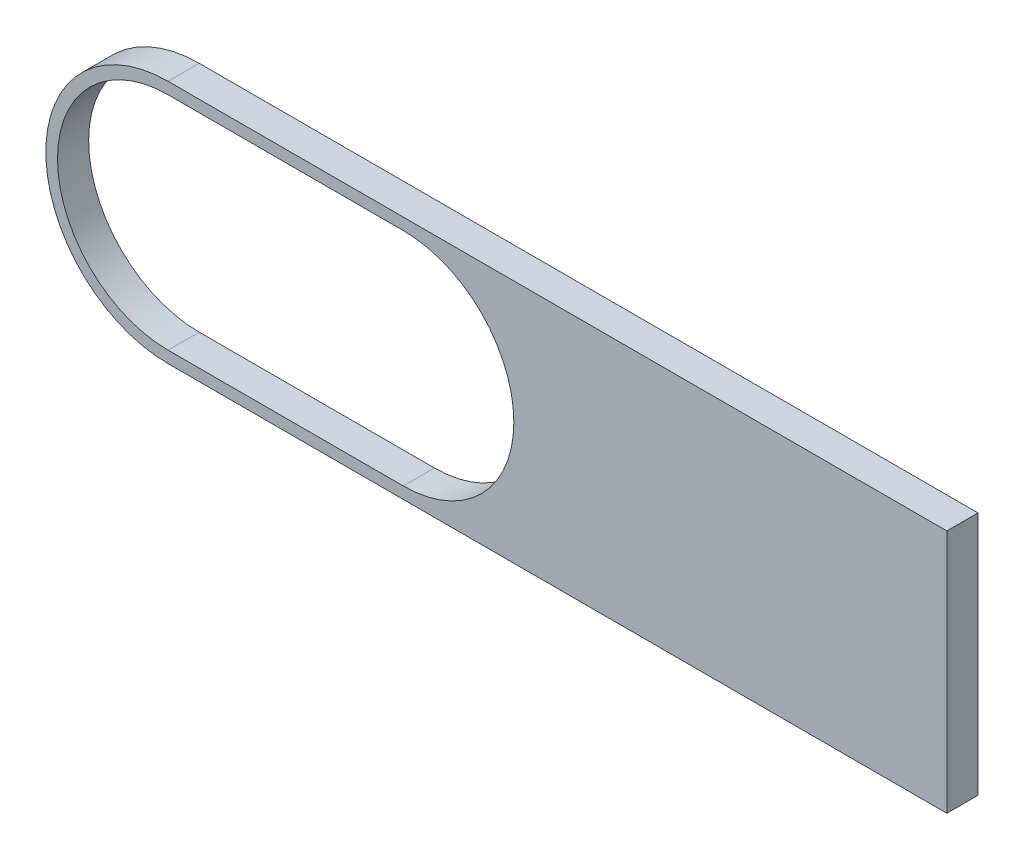
ISO-10303-21;
HEADER;
FILE_DESCRIPTION(('STEP AP214'),'2;1');
FILE_NAME('part.step','',(''),(''),'','','');
FILE_SCHEMA(('AUTOMOTIVE_DESIGN { 1 0 10303 214 1 1 1 1 }'));
ENDSEC;
DATA;
#1=APPLICATION_CONTEXT('core data for automotive mechanical design processes');
#2=APPLICATION_PROTOCOL_DEFINITION('international standard','automotive_design',2000,#1);
#3=PRODUCT_CONTEXT('',#1,'mechanical');
#4=PRODUCT('Part','Part','',(#3));
#5=PRODUCT_RELATED_PRODUCT_CATEGORY('part','',(#4));
#6=PRODUCT_DEFINITION_FORMATION('','',#4);
#7=PRODUCT_DEFINITION_CONTEXT('part definition',#1,'design');
#8=PRODUCT_DEFINITION('design','',#6,#7);
#9=PRODUCT_DEFINITION_SHAPE('','',#8);
#10=(LENGTH_UNIT() NAMED_UNIT(*) SI_UNIT(.MILLI.,.METRE.));
#11=(NAMED_UNIT(*) PLANE_ANGLE_UNIT() SI_UNIT($,.RADIAN.));
#12=(NAMED_UNIT(*) SI_UNIT($,.STERADIAN.) SOLID_ANGLE_UNIT());
#13=UNCERTAINTY_MEASURE_WITH_UNIT(LENGTH_MEASURE(1.E-05),#10,'distance_accuracy_value','');
#14=(GEOMETRIC_REPRESENTATION_CONTEXT(3) GLOBAL_UNCERTAINTY_ASSIGNED_CONTEXT((#13)) GLOBAL_UNIT_ASSIGNED_CONTEXT((#10,
#11,#12)) REPRESENTATION_CONTEXT('',''));
#15=CARTESIAN_POINT('',(0.,0.,0.));
#16=DIRECTION('',(0.,0.,1.));
#17=DIRECTION('',(1.,0.,0.));
#18=AXIS2_PLACEMENT_3D('',#15,#16,#17);
#19=CARTESIAN_POINT('',(0.,18.034,0.));
#20=DIRECTION('',(0.,1.,0.));
#21=DIRECTION('',(0.,0.,1.));
#22=AXIS2_PLACEMENT_3D('',#19,#20,#21);
#23=PLANE('',#22);
#24=DIRECTION('',(0.,0.,1.));
#25=VECTOR('',#24,1.);
#26=CARTESIAN_POINT('',(38.354,18.034,0.));
#27=LINE('',#26,#25);
#28=CARTESIAN_POINT('',(38.354,18.034,0.));
#29=VERTEX_POINT('',#28);
#30=CARTESIAN_POINT('',(38.354,18.034,5.08));
#31=VERTEX_POINT('',#30);
#32=EDGE_CURVE('E52',#29,#31,#27,.T.);
#33=ORIENTED_EDGE('',*,*,#32,.T.);
#34=DIRECTION('',(-1.,0.,0.));
#35=VECTOR('',#34,1.);
#36=CARTESIAN_POINT('',(0.,18.034,5.08));
#37=LINE('',#36,#35);
#38=CARTESIAN_POINT('',(0.,18.034,5.08));
#39=VERTEX_POINT('',#38);
#40=EDGE_CURVE('E108',#31,#39,#37,.T.);
#41=ORIENTED_EDGE('',*,*,#40,.T.);
#42=DIRECTION('',(0.,0.,1.));
#43=VECTOR('',#42,1.);
#44=CARTESIAN_POINT('',(0.,18.034,0.));
#45=LINE('',#44,#43);
#46=CARTESIAN_POINT('',(0.,18.034,0.));
#47=VERTEX_POINT('',#46);
#48=EDGE_CURVE('E107',#47,#39,#45,.T.);
#49=ORIENTED_EDGE('',*,*,#48,.F.);
#50=DIRECTION('',(-1.,0.,0.));
#51=VECTOR('',#50,1.);
#52=CARTESIAN_POINT('',(0.,18.034,0.));
#53=LINE('',#52,#51);
#54=EDGE_CURVE('E48',#29,#47,#53,.T.);
#55=ORIENTED_EDGE('',*,*,#54,.F.);
#56=EDGE_LOOP('',(#33,#41,#49,#55));
#57=FACE_BOUND('',#56,.T.);
#58=ADVANCED_FACE('F33',(#57),#23,.F.);
#59=CARTESIAN_POINT('',(0.,0.,5.08));
#60=DIRECTION('',(0.,0.,-1.));
#61=DIRECTION('',(-1.,0.,0.));
#62=AXIS2_PLACEMENT_3D('',#59,#60,#61);
#63=CYLINDRICAL_SURFACE('',#62,19.939);
#64=DIRECTION('',(0.,0.,-1.));
#65=VECTOR('',#64,1.);
#66=CARTESIAN_POINT('',(0.,-19.939,5.07999999999999));
#67=LINE('',#66,#65);
#68=CARTESIAN_POINT('',(0.,-19.939,5.08));
#69=VERTEX_POINT('',#68);
#70=CARTESIAN_POINT('',(0.,-19.939,0.));
#71=VERTEX_POINT('',#70);
#72=EDGE_CURVE('E116',#69,#71,#67,.T.);
#73=ORIENTED_EDGE('',*,*,#72,.F.);
#74=CARTESIAN_POINT('',(0.,0.,5.08));
#75=DIRECTION('',(0.,0.,1.));
#76=DIRECTION('',(1.,0.,0.));
#77=AXIS2_PLACEMENT_3D('',#74,#75,#76);
#78=CIRCLE('',#77,19.939);
#79=CARTESIAN_POINT('',(0.,19.939,5.08));
#80=VERTEX_POINT('',#79);
#81=EDGE_CURVE('E11',#80,#69,#78,.T.);
#82=ORIENTED_EDGE('',*,*,#81,.F.);
#83=DIRECTION('',(0.,0.,1.));
#84=VECTOR('',#83,1.);
#85=CARTESIAN_POINT('',(0.,19.939,5.08));
#86=LINE('',#85,#84);
#87=CARTESIAN_POINT('',(0.,19.939,0.));
#88=VERTEX_POINT('',#87);
#89=EDGE_CURVE('E120',#88,#80,#86,.T.);
#90=ORIENTED_EDGE('',*,*,#89,.F.);
#91=CARTESIAN_POINT('',(0.,0.,0.));
#92=DIRECTION('',(0.,0.,1.));
#93=DIRECTION('',(1.,0.,0.));
#94=AXIS2_PLACEMENT_3D('',#91,#92,#93);
#95=CIRCLE('',#94,19.939);
#96=EDGE_CURVE('E37',#88,#71,#95,.T.);
#97=ORIENTED_EDGE('',*,*,#96,.T.);
#98=EDGE_LOOP('',(#73,#82,#90,#97));
#99=FACE_BOUND('',#98,.T.);
#100=ADVANCED_FACE('F35',(#99),#63,.T.);
#101=CARTESIAN_POINT('',(0.,0.,5.08));
#102=DIRECTION('',(0.,0.,1.));
#103=DIRECTION('',(1.,0.,0.));
#104=AXIS2_PLACEMENT_3D('',#101,#102,#103);
#105=PLANE('',#104);
#106=ORIENTED_EDGE('',*,*,#40,.F.);
#107=CARTESIAN_POINT('',(38.354,0.,5.08));
#108=DIRECTION('',(0.,0.,-1.));
#109=DIRECTION('',(1.,0.,0.));
#110=AXIS2_PLACEMENT_3D('',#107,#108,#109);
#111=CIRCLE('',#110,18.034);
#112=CARTESIAN_POINT('',(38.354,-18.034,5.08));
#113=VERTEX_POINT('',#112);
#114=EDGE_CURVE('E198',#31,#113,#111,.T.);
#115=ORIENTED_EDGE('',*,*,#114,.T.);
#116=DIRECTION('',(1.,0.,0.));
#117=VECTOR('',#116,1.);
#118=CARTESIAN_POINT('',(0.,-18.034,5.08));
#119=LINE('',#118,#117);
#120=CARTESIAN_POINT('',(0.,-18.034,5.08));
#121=VERTEX_POINT('',#120);
#122=EDGE_CURVE('E104',#121,#113,#119,.T.);
#123=ORIENTED_EDGE('',*,*,#122,.F.);
#124=CARTESIAN_POINT('',(0.,0.,5.08));
#125=DIRECTION('',(0.,0.,1.));
#126=DIRECTION('',(1.,0.,0.));
#127=AXIS2_PLACEMENT_3D('',#124,#125,#126);
#128=CIRCLE('',#127,18.034);
#129=EDGE_CURVE('E117',#39,#121,#128,.T.);
#130=ORIENTED_EDGE('',*,*,#129,.F.);
#131=EDGE_LOOP('',(#106,#115,#123,#130));
#132=FACE_BOUND('',#131,.T.);
#133=ORIENTED_EDGE('',*,*,#81,.T.);
#134=DIRECTION('',(-1.,0.,0.));
#135=VECTOR('',#134,1.);
#136=CARTESIAN_POINT('',(127.,-19.939,5.07999999999999));
#137=LINE('',#136,#135);
#138=CARTESIAN_POINT('',(127.,-19.939,5.07999999999999));
#139=VERTEX_POINT('',#138);
#140=EDGE_CURVE('E145',#139,#69,#137,.T.);
#141=ORIENTED_EDGE('',*,*,#140,.F.);
#142=DIRECTION('',(0.,-1.,0.));
#143=VECTOR('',#142,1.);
#144=CARTESIAN_POINT('',(127.,19.939,5.08));
#145=LINE('',#144,#143);
#146=CARTESIAN_POINT('',(127.,19.939,5.08));
#147=VERTEX_POINT('',#146);
#148=EDGE_CURVE('E125',#147,#139,#145,.T.);
#149=ORIENTED_EDGE('',*,*,#148,.F.);
#150=DIRECTION('',(-1.,0.,0.));
#151=VECTOR('',#150,1.);
#152=CARTESIAN_POINT('',(127.,19.939,5.08));
#153=LINE('',#152,#151);
#154=EDGE_CURVE('E133',#147,#80,#153,.T.);
#155=ORIENTED_EDGE('',*,*,#154,.T.);
#156=EDGE_LOOP('',(#133,#141,#149,#155));
#157=FACE_BOUND('',#156,.T.);
#158=ADVANCED_FACE('F161',(#132,#157),#105,.T.);
#159=CARTESIAN_POINT('',(0.,0.,0.));
#160=DIRECTION('',(0.,0.,1.));
#161=DIRECTION('',(1.,0.,0.));
#162=AXIS2_PLACEMENT_3D('',#159,#160,#161);
#163=PLANE('',#162);
#164=CARTESIAN_POINT('',(38.354,0.,0.));
#165=DIRECTION('',(0.,0.,-1.));
#166=DIRECTION('',(1.,0.,0.));
#167=AXIS2_PLACEMENT_3D('',#164,#165,#166);
#168=CIRCLE('',#167,18.034);
#169=CARTESIAN_POINT('',(38.354,-18.034,0.));
#170=VERTEX_POINT('',#169);
#171=EDGE_CURVE('E102',#29,#170,#168,.T.);
#172=ORIENTED_EDGE('',*,*,#171,.F.);
#173=ORIENTED_EDGE('',*,*,#54,.T.);
#174=CARTESIAN_POINT('',(0.,0.,0.));
#175=DIRECTION('',(0.,0.,1.));
#176=DIRECTION('',(1.,0.,0.));
#177=AXIS2_PLACEMENT_3D('',#174,#175,#176);
#178=CIRCLE('',#177,18.034);
#179=CARTESIAN_POINT('',(0.,-18.034,0.));
#180=VERTEX_POINT('',#179);
#181=EDGE_CURVE('E100',#47,#180,#178,.T.);
#182=ORIENTED_EDGE('',*,*,#181,.T.);
#183=DIRECTION('',(1.,0.,0.));
#184=VECTOR('',#183,1.);
#185=CARTESIAN_POINT('',(0.,-18.034,0.));
#186=LINE('',#185,#184);
#187=EDGE_CURVE('E103',#180,#170,#186,.T.);
#188=ORIENTED_EDGE('',*,*,#187,.T.);
#189=EDGE_LOOP('',(#172,#173,#182,#188));
#190=FACE_BOUND('',#189,.T.);
#191=ORIENTED_EDGE('',*,*,#96,.F.);
#192=DIRECTION('',(-1.,0.,0.));
#193=VECTOR('',#192,1.);
#194=CARTESIAN_POINT('',(127.,19.939,0.));
#195=LINE('',#194,#193);
#196=CARTESIAN_POINT('',(127.,19.939,0.));
#197=VERTEX_POINT('',#196);
#198=EDGE_CURVE('E139',#197,#88,#195,.T.);
#199=ORIENTED_EDGE('',*,*,#198,.F.);
#200=DIRECTION('',(0.,1.,0.));
#201=VECTOR('',#200,1.);
#202=CARTESIAN_POINT('',(127.,19.939,0.));
#203=LINE('',#202,#201);
#204=CARTESIAN_POINT('',(127.,-19.939,0.));
#205=VERTEX_POINT('',#204);
#206=EDGE_CURVE('E130',#205,#197,#203,.T.);
#207=ORIENTED_EDGE('',*,*,#206,.F.);
#208=DIRECTION('',(-1.,0.,0.));
#209=VECTOR('',#208,1.);
#210=CARTESIAN_POINT('',(127.,-19.939,0.));
#211=LINE('',#210,#209);
#212=EDGE_CURVE('E142',#205,#71,#211,.T.);
#213=ORIENTED_EDGE('',*,*,#212,.T.);
#214=EDGE_LOOP('',(#191,#199,#207,#213));
#215=FACE_BOUND('',#214,.T.);
#216=ADVANCED_FACE('F96',(#190,#215),#163,.F.);
#217=CARTESIAN_POINT('',(127.,-19.939,5.07999999999999));
#218=DIRECTION('',(0.,1.,0.));
#219=DIRECTION('',(0.,0.,1.));
#220=AXIS2_PLACEMENT_3D('',#217,#218,#219);
#221=PLANE('',#220);
#222=ORIENTED_EDGE('',*,*,#72,.T.);
#223=ORIENTED_EDGE('',*,*,#212,.F.);
#224=DIRECTION('',(0.,0.,-1.));
#225=VECTOR('',#224,1.);
#226=CARTESIAN_POINT('',(127.,-19.939,5.07999999999999));
#227=LINE('',#226,#225);
#228=EDGE_CURVE('E128',#139,#205,#227,.T.);
#229=ORIENTED_EDGE('',*,*,#228,.F.);
#230=ORIENTED_EDGE('',*,*,#140,.T.);
#231=EDGE_LOOP('',(#222,#223,#229,#230));
#232=FACE_BOUND('',#231,.T.);
#233=ADVANCED_FACE('F153',(#232),#221,.F.);
#234=CARTESIAN_POINT('',(127.,19.939,5.08));
#235=DIRECTION('',(0.,-1.,0.));
#236=DIRECTION('',(0.,0.,-1.));
#237=AXIS2_PLACEMENT_3D('',#234,#235,#236);
#238=PLANE('',#237);
#239=ORIENTED_EDGE('',*,*,#89,.T.);
#240=ORIENTED_EDGE('',*,*,#154,.F.);
#241=DIRECTION('',(0.,0.,1.));
#242=VECTOR('',#241,1.);
#243=CARTESIAN_POINT('',(127.,19.939,5.08));
#244=LINE('',#243,#242);
#245=EDGE_CURVE('E132',#197,#147,#244,.T.);
#246=ORIENTED_EDGE('',*,*,#245,.F.);
#247=ORIENTED_EDGE('',*,*,#198,.T.);
#248=EDGE_LOOP('',(#239,#240,#246,#247));
#249=FACE_BOUND('',#248,.T.);
#250=ADVANCED_FACE('F163',(#249),#238,.F.);
#251=CARTESIAN_POINT('',(127.,0.,0.));
#252=DIRECTION('',(1.,0.,0.));
#253=DIRECTION('',(0.,0.,-1.));
#254=AXIS2_PLACEMENT_3D('',#251,#252,#253);
#255=PLANE('',#254);
#256=ORIENTED_EDGE('',*,*,#148,.T.);
#257=ORIENTED_EDGE('',*,*,#228,.T.);
#258=ORIENTED_EDGE('',*,*,#206,.T.);
#259=ORIENTED_EDGE('',*,*,#245,.T.);
#260=EDGE_LOOP('',(#256,#257,#258,#259));
#261=FACE_BOUND('',#260,.T.);
#262=ADVANCED_FACE('F157',(#261),#255,.T.);
#263=CARTESIAN_POINT('',(0.,0.,0.));
#264=DIRECTION('',(0.,0.,1.));
#265=DIRECTION('',(1.,0.,0.));
#266=AXIS2_PLACEMENT_3D('',#263,#264,#265);
#267=CYLINDRICAL_SURFACE('',#266,18.034);
#268=ORIENTED_EDGE('',*,*,#129,.T.);
#269=DIRECTION('',(0.,0.,1.));
#270=VECTOR('',#269,1.);
#271=CARTESIAN_POINT('',(0.,-18.034,0.));
#272=LINE('',#271,#270);
#273=EDGE_CURVE('E112',#180,#121,#272,.T.);
#274=ORIENTED_EDGE('',*,*,#273,.F.);
#275=ORIENTED_EDGE('',*,*,#181,.F.);
#276=ORIENTED_EDGE('',*,*,#48,.T.);
#277=EDGE_LOOP('',(#268,#274,#275,#276));
#278=FACE_BOUND('',#277,.T.);
#279=ADVANCED_FACE('F115',(#278),#267,.F.);
#280=CARTESIAN_POINT('',(0.,-18.034,0.));
#281=DIRECTION('',(0.,-1.,0.));
#282=DIRECTION('',(0.,0.,-1.));
#283=AXIS2_PLACEMENT_3D('',#280,#281,#282);
#284=PLANE('',#283);
#285=ORIENTED_EDGE('',*,*,#122,.T.);
#286=DIRECTION('',(0.,0.,1.));
#287=VECTOR('',#286,1.);
#288=CARTESIAN_POINT('',(38.354,-18.034,0.));
#289=LINE('',#288,#287);
#290=EDGE_CURVE('E193',#170,#113,#289,.T.);
#291=ORIENTED_EDGE('',*,*,#290,.F.);
#292=ORIENTED_EDGE('',*,*,#187,.F.);
#293=ORIENTED_EDGE('',*,*,#273,.T.);
#294=EDGE_LOOP('',(#285,#291,#292,#293));
#295=FACE_BOUND('',#294,.T.);
#296=ADVANCED_FACE('F179',(#295),#284,.F.);
#297=CARTESIAN_POINT('',(38.354,0.,0.));
#298=DIRECTION('',(0.,0.,1.));
#299=DIRECTION('',(1.,0.,0.));
#300=AXIS2_PLACEMENT_3D('',#297,#298,#299);
#301=CYLINDRICAL_SURFACE('',#300,18.034);
#302=ORIENTED_EDGE('',*,*,#114,.F.);
#303=ORIENTED_EDGE('',*,*,#32,.F.);
#304=ORIENTED_EDGE('',*,*,#171,.T.);
#305=ORIENTED_EDGE('',*,*,#290,.T.);
#306=EDGE_LOOP('',(#302,#303,#304,#305));
#307=FACE_BOUND('',#306,.T.);
#308=ADVANCED_FACE('F185',(#307),#301,.F.);
#309=CLOSED_SHELL('',(#58,#100,#158,#216,#233,#250,#262,#279,#296,#308));
#310=MANIFOLD_SOLID_BREP('B2',#309);
#311=ADVANCED_BREP_SHAPE_REPRESENTATION('',(#18,#310),#14);
#312=SHAPE_DEFINITION_REPRESENTATION(#9,#311);
ENDSEC;
END-ISO-10303-21;
